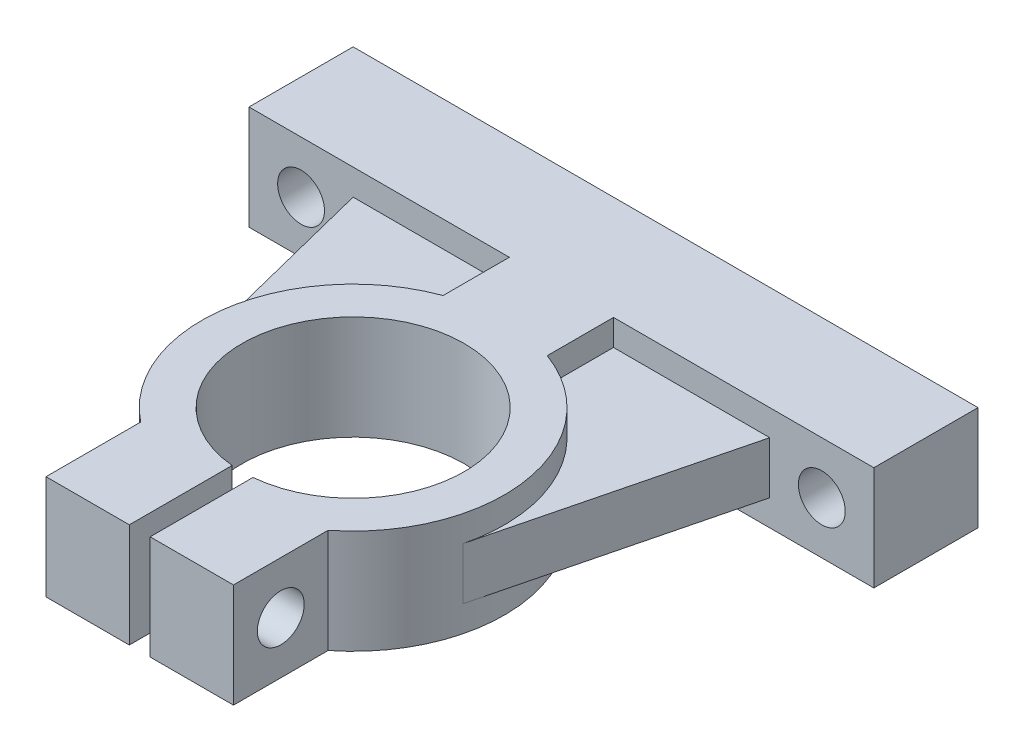
ISO-10303-21;
HEADER;
FILE_DESCRIPTION(('STEP AP214'),'2;1');
FILE_NAME('part.step','',(''),(''),'','','');
FILE_SCHEMA(('AUTOMOTIVE_DESIGN { 1 0 10303 214 1 1 1 1 }'));
ENDSEC;
DATA;
#1=APPLICATION_CONTEXT('core data for automotive mechanical design processes');
#2=APPLICATION_PROTOCOL_DEFINITION('international standard','automotive_design',2000,#1);
#3=PRODUCT_CONTEXT('',#1,'mechanical');
#4=PRODUCT('Part','Part','',(#3));
#5=PRODUCT_RELATED_PRODUCT_CATEGORY('part','',(#4));
#6=PRODUCT_DEFINITION_FORMATION('','',#4);
#7=PRODUCT_DEFINITION_CONTEXT('part definition',#1,'design');
#8=PRODUCT_DEFINITION('design','',#6,#7);
#9=PRODUCT_DEFINITION_SHAPE('','',#8);
#10=(LENGTH_UNIT() NAMED_UNIT(*) SI_UNIT(.MILLI.,.METRE.));
#11=(NAMED_UNIT(*) PLANE_ANGLE_UNIT() SI_UNIT($,.RADIAN.));
#12=(NAMED_UNIT(*) SI_UNIT($,.STERADIAN.) SOLID_ANGLE_UNIT());
#13=UNCERTAINTY_MEASURE_WITH_UNIT(LENGTH_MEASURE(1.E-05),#10,'distance_accuracy_value','');
#14=(GEOMETRIC_REPRESENTATION_CONTEXT(3) GLOBAL_UNCERTAINTY_ASSIGNED_CONTEXT((#13)) GLOBAL_UNIT_ASSIGNED_CONTEXT((#10,
#11,#12)) REPRESENTATION_CONTEXT('',''));
#15=CARTESIAN_POINT('',(0.,0.,0.));
#16=DIRECTION('',(0.,0.,1.));
#17=DIRECTION('',(1.,0.,0.));
#18=AXIS2_PLACEMENT_3D('',#15,#16,#17);
#19=CARTESIAN_POINT('',(0.,5.,30.));
#20=DIRECTION('',(0.,-1.,0.));
#21=DIRECTION('',(0.,0.,-1.));
#22=AXIS2_PLACEMENT_3D('',#19,#20,#21);
#23=CYLINDRICAL_SURFACE('',#22,14.525);
#24=CARTESIAN_POINT('',(0.,-5.,30.));
#25=DIRECTION('',(0.,1.,0.));
#26=DIRECTION('',(0.,0.,1.));
#27=AXIS2_PLACEMENT_3D('',#24,#25,#26);
#28=CIRCLE('',#27,14.525);
#29=CARTESIAN_POINT('',(-4.99999999999999,-5.,16.3627119631504));
#30=VERTEX_POINT('',#29);
#31=CARTESIAN_POINT('',(-9.,-5.,41.4006852864203));
#32=VERTEX_POINT('',#31);
#33=EDGE_CURVE('E63',#30,#32,#28,.T.);
#34=ORIENTED_EDGE('',*,*,#33,.T.);
#35=DIRECTION('',(0.,1.,0.));
#36=VECTOR('',#35,1.);
#37=CARTESIAN_POINT('',(-9.,-17.1088967549045,41.4006852864203));
#38=LINE('',#37,#36);
#39=CARTESIAN_POINT('',(-9.,5.,41.4006852864203));
#40=VERTEX_POINT('',#39);
#41=EDGE_CURVE('E58',#32,#40,#38,.T.);
#42=ORIENTED_EDGE('',*,*,#41,.T.);
#43=CARTESIAN_POINT('',(0.,5.,30.));
#44=DIRECTION('',(0.,1.,0.));
#45=DIRECTION('',(0.,0.,1.));
#46=AXIS2_PLACEMENT_3D('',#43,#44,#45);
#47=CIRCLE('',#46,14.525);
#48=CARTESIAN_POINT('',(-4.99999999999999,5.,16.3627119631504));
#49=VERTEX_POINT('',#48);
#50=EDGE_CURVE('E223',#49,#40,#47,.T.);
#51=ORIENTED_EDGE('',*,*,#50,.F.);
#52=DIRECTION('',(0.,-1.,0.));
#53=VECTOR('',#52,1.);
#54=CARTESIAN_POINT('',(-4.99999999999999,5.,16.3627119631504));
#55=LINE('',#54,#53);
#56=CARTESIAN_POINT('',(-4.99999999999999,2.5,16.3627119631504));
#57=VERTEX_POINT('',#56);
#58=EDGE_CURVE('E391',#49,#57,#55,.T.);
#59=ORIENTED_EDGE('',*,*,#58,.T.);
#60=CARTESIAN_POINT('',(0.,2.5,30.));
#61=DIRECTION('',(0.,1.,0.));
#62=DIRECTION('',(0.,0.,1.));
#63=AXIS2_PLACEMENT_3D('',#60,#61,#62);
#64=CIRCLE('',#63,14.525);
#65=CARTESIAN_POINT('',(-14.0873705997255,2.5,33.5385893497255));
#66=VERTEX_POINT('',#65);
#67=EDGE_CURVE('E262',#57,#66,#64,.T.);
#68=ORIENTED_EDGE('',*,*,#67,.T.);
#69=DIRECTION('',(0.,-1.,0.));
#70=VECTOR('',#69,1.);
#71=CARTESIAN_POINT('',(-14.0873705997255,2.5,33.5385893497255));
#72=LINE('',#71,#70);
#73=CARTESIAN_POINT('',(-14.0873705997255,-2.5,33.5385893497255));
#74=VERTEX_POINT('',#73);
#75=EDGE_CURVE('E272',#66,#74,#72,.T.);
#76=ORIENTED_EDGE('',*,*,#75,.T.);
#77=CARTESIAN_POINT('',(0.,-2.5,30.));
#78=DIRECTION('',(0.,1.,0.));
#79=DIRECTION('',(0.,0.,1.));
#80=AXIS2_PLACEMENT_3D('',#77,#78,#79);
#81=CIRCLE('',#80,14.525);
#82=CARTESIAN_POINT('',(-4.99999999999999,-2.5,16.3627119631504));
#83=VERTEX_POINT('',#82);
#84=EDGE_CURVE('E273',#83,#74,#81,.T.);
#85=ORIENTED_EDGE('',*,*,#84,.F.);
#86=EDGE_CURVE('E390',#83,#30,#55,.T.);
#87=ORIENTED_EDGE('',*,*,#86,.T.);
#88=EDGE_LOOP('',(#34,#42,#51,#59,#68,#76,#85,#87));
#89=FACE_BOUND('',#88,.T.);
#90=ADVANCED_FACE('F43',(#89),#23,.T.);
#91=CARTESIAN_POINT('',(-5.,5.,10.));
#92=DIRECTION('',(1.,0.,0.));
#93=DIRECTION('',(0.,0.,-1.));
#94=AXIS2_PLACEMENT_3D('',#91,#92,#93);
#95=PLANE('',#94);
#96=DIRECTION('',(0.,0.,1.));
#97=VECTOR('',#96,1.);
#98=CARTESIAN_POINT('',(-5.00000000000001,-2.5,0.));
#99=LINE('',#98,#97);
#100=CARTESIAN_POINT('',(-5.,-2.5,10.));
#101=VERTEX_POINT('',#100);
#102=EDGE_CURVE('E276',#101,#83,#99,.T.);
#103=ORIENTED_EDGE('',*,*,#102,.F.);
#104=DIRECTION('',(0.,-1.,0.));
#105=VECTOR('',#104,1.);
#106=CARTESIAN_POINT('',(-5.,5.,10.));
#107=LINE('',#106,#105);
#108=CARTESIAN_POINT('',(-5.,-5.,10.));
#109=VERTEX_POINT('',#108);
#110=EDGE_CURVE('E349',#101,#109,#107,.T.);
#111=ORIENTED_EDGE('',*,*,#110,.T.);
#112=DIRECTION('',(0.,0.,1.));
#113=VECTOR('',#112,1.);
#114=CARTESIAN_POINT('',(-5.,-5.,10.));
#115=LINE('',#114,#113);
#116=EDGE_CURVE('E329',#109,#30,#115,.T.);
#117=ORIENTED_EDGE('',*,*,#116,.T.);
#118=ORIENTED_EDGE('',*,*,#86,.F.);
#119=EDGE_LOOP('',(#103,#111,#117,#118));
#120=FACE_BOUND('',#119,.T.);
#121=ADVANCED_FACE('F462',(#120),#95,.F.);
#122=CARTESIAN_POINT('',(5.,5.,9.99999999999999));
#123=DIRECTION('',(-1.,0.,0.));
#124=DIRECTION('',(0.,0.,1.));
#125=AXIS2_PLACEMENT_3D('',#122,#123,#124);
#126=PLANE('',#125);
#127=DIRECTION('',(0.,0.,1.));
#128=VECTOR('',#127,1.);
#129=CARTESIAN_POINT('',(5.00000000000001,-2.5,0.));
#130=LINE('',#129,#128);
#131=CARTESIAN_POINT('',(5.,-2.5,9.99999999999999));
#132=VERTEX_POINT('',#131);
#133=CARTESIAN_POINT('',(5.,-2.5,16.3627119631504));
#134=VERTEX_POINT('',#133);
#135=EDGE_CURVE('E259',#132,#134,#130,.T.);
#136=ORIENTED_EDGE('',*,*,#135,.T.);
#137=DIRECTION('',(0.,-1.,0.));
#138=VECTOR('',#137,1.);
#139=CARTESIAN_POINT('',(5.,5.,16.3627119631504));
#140=LINE('',#139,#138);
#141=CARTESIAN_POINT('',(5.,-5.,16.3627119631504));
#142=VERTEX_POINT('',#141);
#143=EDGE_CURVE('E386',#134,#142,#140,.T.);
#144=ORIENTED_EDGE('',*,*,#143,.T.);
#145=DIRECTION('',(0.,0.,-1.));
#146=VECTOR('',#145,1.);
#147=CARTESIAN_POINT('',(5.,-5.,9.99999999999999));
#148=LINE('',#147,#146);
#149=CARTESIAN_POINT('',(5.,-5.,9.99999999999999));
#150=VERTEX_POINT('',#149);
#151=EDGE_CURVE('E354',#142,#150,#148,.T.);
#152=ORIENTED_EDGE('',*,*,#151,.T.);
#153=DIRECTION('',(0.,-1.,0.));
#154=VECTOR('',#153,1.);
#155=CARTESIAN_POINT('',(5.,5.,9.99999999999999));
#156=LINE('',#155,#154);
#157=EDGE_CURVE('E382',#132,#150,#156,.T.);
#158=ORIENTED_EDGE('',*,*,#157,.F.);
#159=EDGE_LOOP('',(#136,#144,#152,#158));
#160=FACE_BOUND('',#159,.T.);
#161=ADVANCED_FACE('F474',(#160),#126,.F.);
#162=CARTESIAN_POINT('',(0.,5.,30.));
#163=DIRECTION('',(0.,1.,0.));
#164=DIRECTION('',(0.,0.,1.));
#165=AXIS2_PLACEMENT_3D('',#162,#163,#164);
#166=PLANE('',#165);
#167=DIRECTION('',(0.,0.,1.));
#168=VECTOR('',#167,1.);
#169=CARTESIAN_POINT('',(-0.999999999999999,5.,46.5965));
#170=LINE('',#169,#168);
#171=CARTESIAN_POINT('',(-0.999999999999999,5.,40.6210274455911));
#172=VERTEX_POINT('',#171);
#173=CARTESIAN_POINT('',(-0.999999999999999,5.,50.490535704383));
#174=VERTEX_POINT('',#173);
#175=EDGE_CURVE('E236',#172,#174,#170,.T.);
#176=ORIENTED_EDGE('',*,*,#175,.F.);
#177=CARTESIAN_POINT('',(0.,5.,30.));
#178=DIRECTION('',(0.,1.,0.));
#179=DIRECTION('',(0.,0.,1.));
#180=AXIS2_PLACEMENT_3D('',#177,#178,#179);
#181=CIRCLE('',#180,10.668);
#182=CARTESIAN_POINT('',(1.,5.,40.6210274455911));
#183=VERTEX_POINT('',#182);
#184=EDGE_CURVE('E326',#183,#172,#181,.T.);
#185=ORIENTED_EDGE('',*,*,#184,.F.);
#186=DIRECTION('',(0.,0.,-1.));
#187=VECTOR('',#186,1.);
#188=CARTESIAN_POINT('',(1.,5.,46.5965));
#189=LINE('',#188,#187);
#190=CARTESIAN_POINT('',(0.999999999999999,5.,50.490535704383));
#191=VERTEX_POINT('',#190);
#192=EDGE_CURVE('E256',#191,#183,#189,.T.);
#193=ORIENTED_EDGE('',*,*,#192,.F.);
#194=DIRECTION('',(1.,0.,0.));
#195=VECTOR('',#194,1.);
#196=CARTESIAN_POINT('',(0.999999999999999,5.,50.490535704383));
#197=LINE('',#196,#195);
#198=CARTESIAN_POINT('',(9.,5.,50.4905357043831));
#199=VERTEX_POINT('',#198);
#200=EDGE_CURVE('E224',#191,#199,#197,.T.);
#201=ORIENTED_EDGE('',*,*,#200,.T.);
#202=DIRECTION('',(0.,0.,-1.));
#203=VECTOR('',#202,1.);
#204=CARTESIAN_POINT('',(9.,5.,50.4905357043831));
#205=LINE('',#204,#203);
#206=CARTESIAN_POINT('',(9.,5.,41.4006852864203));
#207=VERTEX_POINT('',#206);
#208=EDGE_CURVE('E227',#199,#207,#205,.T.);
#209=ORIENTED_EDGE('',*,*,#208,.T.);
#210=CARTESIAN_POINT('',(5.,5.,16.3627119631504));
#211=VERTEX_POINT('',#210);
#212=EDGE_CURVE('E334',#207,#211,#47,.T.);
#213=ORIENTED_EDGE('',*,*,#212,.T.);
#214=DIRECTION('',(0.,0.,-1.));
#215=VECTOR('',#214,1.);
#216=CARTESIAN_POINT('',(5.,5.,9.99999999999999));
#217=LINE('',#216,#215);
#218=CARTESIAN_POINT('',(5.,5.,9.99999999999999));
#219=VERTEX_POINT('',#218);
#220=EDGE_CURVE('E337',#211,#219,#217,.T.);
#221=ORIENTED_EDGE('',*,*,#220,.T.);
#222=DIRECTION('',(1.,0.,0.));
#223=VECTOR('',#222,1.);
#224=CARTESIAN_POINT('',(30.,5.,9.99999999999999));
#225=LINE('',#224,#223);
#226=CARTESIAN_POINT('',(30.,5.,9.99999999999999));
#227=VERTEX_POINT('',#226);
#228=EDGE_CURVE('E339',#219,#227,#225,.T.);
#229=ORIENTED_EDGE('',*,*,#228,.T.);
#230=DIRECTION('',(0.,0.,-1.));
#231=VECTOR('',#230,1.);
#232=CARTESIAN_POINT('',(30.,5.,0.));
#233=LINE('',#232,#231);
#234=CARTESIAN_POINT('',(30.,5.,0.));
#235=VERTEX_POINT('',#234);
#236=EDGE_CURVE('E341',#227,#235,#233,.T.);
#237=ORIENTED_EDGE('',*,*,#236,.T.);
#238=DIRECTION('',(-1.,0.,0.));
#239=VECTOR('',#238,1.);
#240=CARTESIAN_POINT('',(30.,5.,0.));
#241=LINE('',#240,#239);
#242=CARTESIAN_POINT('',(-30.,5.,0.));
#243=VERTEX_POINT('',#242);
#244=EDGE_CURVE('E343',#235,#243,#241,.T.);
#245=ORIENTED_EDGE('',*,*,#244,.T.);
#246=DIRECTION('',(0.,0.,1.));
#247=VECTOR('',#246,1.);
#248=CARTESIAN_POINT('',(-30.,5.,0.));
#249=LINE('',#248,#247);
#250=CARTESIAN_POINT('',(-30.,5.,10.));
#251=VERTEX_POINT('',#250);
#252=EDGE_CURVE('E345',#243,#251,#249,.T.);
#253=ORIENTED_EDGE('',*,*,#252,.T.);
#254=DIRECTION('',(1.,0.,0.));
#255=VECTOR('',#254,1.);
#256=CARTESIAN_POINT('',(-30.,5.,10.));
#257=LINE('',#256,#255);
#258=CARTESIAN_POINT('',(-5.,5.,10.));
#259=VERTEX_POINT('',#258);
#260=EDGE_CURVE('E347',#251,#259,#257,.T.);
#261=ORIENTED_EDGE('',*,*,#260,.T.);
#262=DIRECTION('',(0.,0.,1.));
#263=VECTOR('',#262,1.);
#264=CARTESIAN_POINT('',(-5.,5.,10.));
#265=LINE('',#264,#263);
#266=EDGE_CURVE('E332',#259,#49,#265,.T.);
#267=ORIENTED_EDGE('',*,*,#266,.T.);
#268=ORIENTED_EDGE('',*,*,#50,.T.);
#269=DIRECTION('',(0.,0.,1.));
#270=VECTOR('',#269,1.);
#271=CARTESIAN_POINT('',(-9.,5.,50.4905357043831));
#272=LINE('',#271,#270);
#273=CARTESIAN_POINT('',(-9.,5.,50.4905357043831));
#274=VERTEX_POINT('',#273);
#275=EDGE_CURVE('E207',#40,#274,#272,.T.);
#276=ORIENTED_EDGE('',*,*,#275,.T.);
#277=DIRECTION('',(1.,0.,0.));
#278=VECTOR('',#277,1.);
#279=CARTESIAN_POINT('',(-0.999999999999999,5.,50.490535704383));
#280=LINE('',#279,#278);
#281=EDGE_CURVE('E215',#274,#174,#280,.T.);
#282=ORIENTED_EDGE('',*,*,#281,.T.);
#283=EDGE_LOOP('',(#176,#185,#193,#201,#209,#213,#221,#229,#237,#245,#253,#261,#267,#268,#276,#282));
#284=FACE_BOUND('',#283,.T.);
#285=ADVANCED_FACE('F221',(#284),#166,.T.);
#286=CARTESIAN_POINT('',(0.,-5.,30.));
#287=DIRECTION('',(0.,1.,0.));
#288=DIRECTION('',(0.,0.,1.));
#289=AXIS2_PLACEMENT_3D('',#286,#287,#288);
#290=PLANE('',#289);
#291=CARTESIAN_POINT('',(0.,-5.,30.));
#292=DIRECTION('',(0.,1.,0.));
#293=DIRECTION('',(0.,0.,1.));
#294=AXIS2_PLACEMENT_3D('',#291,#292,#293);
#295=CIRCLE('',#294,10.668);
#296=CARTESIAN_POINT('',(1.,-5.,40.6210274455911));
#297=VERTEX_POINT('',#296);
#298=CARTESIAN_POINT('',(-1.,-5.,40.6210274455911));
#299=VERTEX_POINT('',#298);
#300=EDGE_CURVE('E321',#297,#299,#295,.T.);
#301=ORIENTED_EDGE('',*,*,#300,.T.);
#302=DIRECTION('',(0.,0.,1.));
#303=VECTOR('',#302,1.);
#304=CARTESIAN_POINT('',(-0.999999999999999,-5.,46.5965));
#305=LINE('',#304,#303);
#306=CARTESIAN_POINT('',(-0.999999999999999,-5.,50.490535704383));
#307=VERTEX_POINT('',#306);
#308=EDGE_CURVE('E253',#299,#307,#305,.T.);
#309=ORIENTED_EDGE('',*,*,#308,.T.);
#310=DIRECTION('',(-1.,0.,0.));
#311=VECTOR('',#310,1.);
#312=CARTESIAN_POINT('',(-0.999999999999999,-5.,50.490535704383));
#313=LINE('',#312,#311);
#314=CARTESIAN_POINT('',(-9.,-5.,50.4905357043831));
#315=VERTEX_POINT('',#314);
#316=EDGE_CURVE('E230',#307,#315,#313,.T.);
#317=ORIENTED_EDGE('',*,*,#316,.T.);
#318=DIRECTION('',(0.,0.,-1.));
#319=VECTOR('',#318,1.);
#320=CARTESIAN_POINT('',(-9.,-5.,50.4905357043831));
#321=LINE('',#320,#319);
#322=EDGE_CURVE('E208',#315,#32,#321,.T.);
#323=ORIENTED_EDGE('',*,*,#322,.T.);
#324=ORIENTED_EDGE('',*,*,#33,.F.);
#325=ORIENTED_EDGE('',*,*,#116,.F.);
#326=DIRECTION('',(1.,0.,0.));
#327=VECTOR('',#326,1.);
#328=CARTESIAN_POINT('',(-30.,-5.,10.));
#329=LINE('',#328,#327);
#330=CARTESIAN_POINT('',(-30.,-5.,10.));
#331=VERTEX_POINT('',#330);
#332=EDGE_CURVE('E335',#331,#109,#329,.T.);
#333=ORIENTED_EDGE('',*,*,#332,.F.);
#334=DIRECTION('',(0.,0.,1.));
#335=VECTOR('',#334,1.);
#336=CARTESIAN_POINT('',(-30.,-5.,0.));
#337=LINE('',#336,#335);
#338=CARTESIAN_POINT('',(-30.,-5.,0.));
#339=VERTEX_POINT('',#338);
#340=EDGE_CURVE('E363',#339,#331,#337,.T.);
#341=ORIENTED_EDGE('',*,*,#340,.F.);
#342=DIRECTION('',(-1.,0.,0.));
#343=VECTOR('',#342,1.);
#344=CARTESIAN_POINT('',(30.,-5.,0.));
#345=LINE('',#344,#343);
#346=CARTESIAN_POINT('',(30.,-5.,0.));
#347=VERTEX_POINT('',#346);
#348=EDGE_CURVE('E361',#347,#339,#345,.T.);
#349=ORIENTED_EDGE('',*,*,#348,.F.);
#350=DIRECTION('',(0.,0.,-1.));
#351=VECTOR('',#350,1.);
#352=CARTESIAN_POINT('',(30.,-5.,0.));
#353=LINE('',#352,#351);
#354=CARTESIAN_POINT('',(30.,-5.,9.99999999999999));
#355=VERTEX_POINT('',#354);
#356=EDGE_CURVE('E359',#355,#347,#353,.T.);
#357=ORIENTED_EDGE('',*,*,#356,.F.);
#358=DIRECTION('',(1.,0.,0.));
#359=VECTOR('',#358,1.);
#360=CARTESIAN_POINT('',(30.,-5.,9.99999999999999));
#361=LINE('',#360,#359);
#362=EDGE_CURVE('E357',#150,#355,#361,.T.);
#363=ORIENTED_EDGE('',*,*,#362,.F.);
#364=ORIENTED_EDGE('',*,*,#151,.F.);
#365=CARTESIAN_POINT('',(9.,-5.,41.4006852864203));
#366=VERTEX_POINT('',#365);
#367=EDGE_CURVE('E352',#366,#142,#28,.T.);
#368=ORIENTED_EDGE('',*,*,#367,.F.);
#369=DIRECTION('',(0.,0.,1.));
#370=VECTOR('',#369,1.);
#371=CARTESIAN_POINT('',(9.,-5.,50.4905357043831));
#372=LINE('',#371,#370);
#373=CARTESIAN_POINT('',(9.,-5.,50.4905357043831));
#374=VERTEX_POINT('',#373);
#375=EDGE_CURVE('E237',#366,#374,#372,.T.);
#376=ORIENTED_EDGE('',*,*,#375,.T.);
#377=DIRECTION('',(-1.,0.,0.));
#378=VECTOR('',#377,1.);
#379=CARTESIAN_POINT('',(0.999999999999999,-5.,50.490535704383));
#380=LINE('',#379,#378);
#381=CARTESIAN_POINT('',(0.999999999999999,-5.,50.490535704383));
#382=VERTEX_POINT('',#381);
#383=EDGE_CURVE('E239',#374,#382,#380,.T.);
#384=ORIENTED_EDGE('',*,*,#383,.T.);
#385=DIRECTION('',(0.,0.,-1.));
#386=VECTOR('',#385,1.);
#387=CARTESIAN_POINT('',(1.,-5.,46.5965));
#388=LINE('',#387,#386);
#389=EDGE_CURVE('E255',#382,#297,#388,.T.);
#390=ORIENTED_EDGE('',*,*,#389,.T.);
#391=EDGE_LOOP('',(#301,#309,#317,#323,#324,#325,#333,#341,#349,#357,#363,#364,#368,#376,#384,#390));
#392=FACE_BOUND('',#391,.T.);
#393=ADVANCED_FACE('F400',(#392),#290,.F.);
#394=CARTESIAN_POINT('',(-5.,2.5,10.));
#395=VERTEX_POINT('',#394);
#396=EDGE_CURVE('E367',#259,#395,#107,.T.);
#397=ORIENTED_EDGE('',*,*,#396,.T.);
#398=DIRECTION('',(0.,0.,1.));
#399=VECTOR('',#398,1.);
#400=CARTESIAN_POINT('',(-5.00000000000001,2.5,0.));
#401=LINE('',#400,#399);
#402=EDGE_CURVE('E264',#395,#57,#401,.T.);
#403=ORIENTED_EDGE('',*,*,#402,.T.);
#404=ORIENTED_EDGE('',*,*,#58,.F.);
#405=ORIENTED_EDGE('',*,*,#266,.F.);
#406=EDGE_LOOP('',(#397,#403,#404,#405));
#407=FACE_BOUND('',#406,.T.);
#408=ADVANCED_FACE('F45',(#407),#95,.F.);
#409=ORIENTED_EDGE('',*,*,#212,.F.);
#410=DIRECTION('',(0.,1.,0.));
#411=VECTOR('',#410,1.);
#412=CARTESIAN_POINT('',(9.,-17.1088967549045,41.4006852864203));
#413=LINE('',#412,#411);
#414=EDGE_CURVE('E243',#366,#207,#413,.T.);
#415=ORIENTED_EDGE('',*,*,#414,.F.);
#416=ORIENTED_EDGE('',*,*,#367,.T.);
#417=ORIENTED_EDGE('',*,*,#143,.F.);
#418=CARTESIAN_POINT('',(0.,-2.5,30.));
#419=DIRECTION('',(0.,1.,0.));
#420=DIRECTION('',(0.,0.,1.));
#421=AXIS2_PLACEMENT_3D('',#418,#419,#420);
#422=CIRCLE('',#421,14.525);
#423=CARTESIAN_POINT('',(14.0873705997255,-2.5,33.5385893497255));
#424=VERTEX_POINT('',#423);
#425=EDGE_CURVE('E305',#134,#424,#422,.F.);
#426=ORIENTED_EDGE('',*,*,#425,.T.);
#427=DIRECTION('',(0.,-1.,0.));
#428=VECTOR('',#427,1.);
#429=CARTESIAN_POINT('',(14.0873705997255,2.5,33.5385893497255));
#430=LINE('',#429,#428);
#431=CARTESIAN_POINT('',(14.0873705997255,2.5,33.5385893497255));
#432=VERTEX_POINT('',#431);
#433=EDGE_CURVE('E277',#432,#424,#430,.T.);
#434=ORIENTED_EDGE('',*,*,#433,.F.);
#435=CARTESIAN_POINT('',(0.,2.5,30.));
#436=DIRECTION('',(0.,1.,0.));
#437=DIRECTION('',(0.,0.,1.));
#438=AXIS2_PLACEMENT_3D('',#435,#436,#437);
#439=CIRCLE('',#438,14.525);
#440=CARTESIAN_POINT('',(5.,2.5,16.3627119631504));
#441=VERTEX_POINT('',#440);
#442=EDGE_CURVE('E293',#441,#432,#439,.F.);
#443=ORIENTED_EDGE('',*,*,#442,.F.);
#444=EDGE_CURVE('E387',#211,#441,#140,.T.);
#445=ORIENTED_EDGE('',*,*,#444,.F.);
#446=EDGE_LOOP('',(#409,#415,#416,#417,#426,#434,#443,#445));
#447=FACE_BOUND('',#446,.T.);
#448=ADVANCED_FACE('F419',(#447),#23,.T.);
#449=ORIENTED_EDGE('',*,*,#444,.T.);
#450=DIRECTION('',(0.,0.,1.));
#451=VECTOR('',#450,1.);
#452=CARTESIAN_POINT('',(5.00000000000001,2.5,0.));
#453=LINE('',#452,#451);
#454=CARTESIAN_POINT('',(5.,2.5,9.99999999999999));
#455=VERTEX_POINT('',#454);
#456=EDGE_CURVE('E290',#455,#441,#453,.T.);
#457=ORIENTED_EDGE('',*,*,#456,.F.);
#458=EDGE_CURVE('E383',#219,#455,#156,.T.);
#459=ORIENTED_EDGE('',*,*,#458,.F.);
#460=ORIENTED_EDGE('',*,*,#220,.F.);
#461=EDGE_LOOP('',(#449,#457,#459,#460));
#462=FACE_BOUND('',#461,.T.);
#463=ADVANCED_FACE('F421',(#462),#126,.F.);
#464=CARTESIAN_POINT('',(30.,5.,9.99999999999999));
#465=DIRECTION('',(0.,0.,-1.));
#466=DIRECTION('',(-1.,0.,0.));
#467=AXIS2_PLACEMENT_3D('',#464,#465,#466);
#468=PLANE('',#467);
#469=CARTESIAN_POINT('',(25.,0.,9.99999999999999));
#470=DIRECTION('',(0.,0.,-1.));
#471=DIRECTION('',(-1.,0.,0.));
#472=AXIS2_PLACEMENT_3D('',#469,#470,#471);
#473=CIRCLE('',#472,2.25);
#474=CARTESIAN_POINT('',(22.75,0.,9.99999999999999));
#475=VERTEX_POINT('',#474);
#476=EDGE_CURVE('E289',#475,#475,#473,.F.);
#477=ORIENTED_EDGE('',*,*,#476,.F.);
#478=EDGE_LOOP('',(#477));
#479=FACE_BOUND('',#478,.T.);
#480=ORIENTED_EDGE('',*,*,#458,.T.);
#481=DIRECTION('',(-1.,0.,0.));
#482=VECTOR('',#481,1.);
#483=CARTESIAN_POINT('',(0.,2.5,9.99999999999999));
#484=LINE('',#483,#482);
#485=CARTESIAN_POINT('',(20.,2.5,9.99999999999999));
#486=VERTEX_POINT('',#485);
#487=EDGE_CURVE('E300',#486,#455,#484,.T.);
#488=ORIENTED_EDGE('',*,*,#487,.F.);
#489=DIRECTION('',(0.,-1.,0.));
#490=VECTOR('',#489,1.);
#491=CARTESIAN_POINT('',(20.,2.5,10.));
#492=LINE('',#491,#490);
#493=CARTESIAN_POINT('',(20.,-2.5,10.));
#494=VERTEX_POINT('',#493);
#495=EDGE_CURVE('E303',#486,#494,#492,.T.);
#496=ORIENTED_EDGE('',*,*,#495,.T.);
#497=DIRECTION('',(-1.,0.,0.));
#498=VECTOR('',#497,1.);
#499=CARTESIAN_POINT('',(0.,-2.5,9.99999999999999));
#500=LINE('',#499,#498);
#501=EDGE_CURVE('E294',#494,#132,#500,.T.);
#502=ORIENTED_EDGE('',*,*,#501,.T.);
#503=ORIENTED_EDGE('',*,*,#157,.T.);
#504=ORIENTED_EDGE('',*,*,#362,.T.);
#505=DIRECTION('',(0.,-1.,0.));
#506=VECTOR('',#505,1.);
#507=CARTESIAN_POINT('',(30.,5.,9.99999999999999));
#508=LINE('',#507,#506);
#509=EDGE_CURVE('E379',#227,#355,#508,.T.);
#510=ORIENTED_EDGE('',*,*,#509,.F.);
#511=ORIENTED_EDGE('',*,*,#228,.F.);
#512=EDGE_LOOP('',(#480,#488,#496,#502,#503,#504,#510,#511));
#513=FACE_BOUND('',#512,.T.);
#514=ADVANCED_FACE('F425',(#479,#513),#468,.F.);
#515=CARTESIAN_POINT('',(30.,5.,0.));
#516=DIRECTION('',(-1.,0.,0.));
#517=DIRECTION('',(0.,0.,1.));
#518=AXIS2_PLACEMENT_3D('',#515,#516,#517);
#519=PLANE('',#518);
#520=ORIENTED_EDGE('',*,*,#356,.T.);
#521=DIRECTION('',(0.,-1.,0.));
#522=VECTOR('',#521,1.);
#523=CARTESIAN_POINT('',(30.,5.,0.));
#524=LINE('',#523,#522);
#525=EDGE_CURVE('E376',#235,#347,#524,.T.);
#526=ORIENTED_EDGE('',*,*,#525,.F.);
#527=ORIENTED_EDGE('',*,*,#236,.F.);
#528=ORIENTED_EDGE('',*,*,#509,.T.);
#529=EDGE_LOOP('',(#520,#526,#527,#528));
#530=FACE_BOUND('',#529,.T.);
#531=ADVANCED_FACE('F431',(#530),#519,.F.);
#532=CARTESIAN_POINT('',(30.,5.,0.));
#533=DIRECTION('',(0.,0.,1.));
#534=DIRECTION('',(1.,0.,0.));
#535=AXIS2_PLACEMENT_3D('',#532,#533,#534);
#536=PLANE('',#535);
#537=CARTESIAN_POINT('',(-25.,0.,0.));
#538=DIRECTION('',(0.,0.,-1.));
#539=DIRECTION('',(-1.,0.,0.));
#540=AXIS2_PLACEMENT_3D('',#537,#538,#539);
#541=CIRCLE('',#540,2.25);
#542=CARTESIAN_POINT('',(-27.25,0.,0.));
#543=VERTEX_POINT('',#542);
#544=EDGE_CURVE('E314',#543,#543,#541,.T.);
#545=ORIENTED_EDGE('',*,*,#544,.F.);
#546=EDGE_LOOP('',(#545));
#547=FACE_BOUND('',#546,.T.);
#548=CARTESIAN_POINT('',(25.,0.,0.));
#549=DIRECTION('',(0.,0.,-1.));
#550=DIRECTION('',(-1.,0.,0.));
#551=AXIS2_PLACEMENT_3D('',#548,#549,#550);
#552=CIRCLE('',#551,2.25);
#553=CARTESIAN_POINT('',(22.75,0.,0.));
#554=VERTEX_POINT('',#553);
#555=EDGE_CURVE('E318',#554,#554,#552,.T.);
#556=ORIENTED_EDGE('',*,*,#555,.F.);
#557=EDGE_LOOP('',(#556));
#558=FACE_BOUND('',#557,.T.);
#559=ORIENTED_EDGE('',*,*,#348,.T.);
#560=DIRECTION('',(0.,-1.,0.));
#561=VECTOR('',#560,1.);
#562=CARTESIAN_POINT('',(-30.,5.,0.));
#563=LINE('',#562,#561);
#564=EDGE_CURVE('E373',#243,#339,#563,.T.);
#565=ORIENTED_EDGE('',*,*,#564,.F.);
#566=ORIENTED_EDGE('',*,*,#244,.F.);
#567=ORIENTED_EDGE('',*,*,#525,.T.);
#568=EDGE_LOOP('',(#559,#565,#566,#567));
#569=FACE_BOUND('',#568,.T.);
#570=ADVANCED_FACE('F435',(#547,#558,#569),#536,.F.);
#571=CARTESIAN_POINT('',(-30.,5.,0.));
#572=DIRECTION('',(1.,0.,0.));
#573=DIRECTION('',(0.,0.,-1.));
#574=AXIS2_PLACEMENT_3D('',#571,#572,#573);
#575=PLANE('',#574);
#576=ORIENTED_EDGE('',*,*,#340,.T.);
#577=DIRECTION('',(0.,-1.,0.));
#578=VECTOR('',#577,1.);
#579=CARTESIAN_POINT('',(-30.,5.,10.));
#580=LINE('',#579,#578);
#581=EDGE_CURVE('E370',#251,#331,#580,.T.);
#582=ORIENTED_EDGE('',*,*,#581,.F.);
#583=ORIENTED_EDGE('',*,*,#252,.F.);
#584=ORIENTED_EDGE('',*,*,#564,.T.);
#585=EDGE_LOOP('',(#576,#582,#583,#584));
#586=FACE_BOUND('',#585,.T.);
#587=ADVANCED_FACE('F440',(#586),#575,.F.);
#588=CARTESIAN_POINT('',(-30.,5.,10.));
#589=DIRECTION('',(0.,0.,-1.));
#590=DIRECTION('',(-1.,0.,0.));
#591=AXIS2_PLACEMENT_3D('',#588,#589,#590);
#592=PLANE('',#591);
#593=CARTESIAN_POINT('',(-25.,0.,10.));
#594=DIRECTION('',(0.,0.,-1.));
#595=DIRECTION('',(-1.,0.,0.));
#596=AXIS2_PLACEMENT_3D('',#593,#594,#595);
#597=CIRCLE('',#596,2.25);
#598=CARTESIAN_POINT('',(-27.25,0.,10.));
#599=VERTEX_POINT('',#598);
#600=EDGE_CURVE('E317',#599,#599,#597,.F.);
#601=ORIENTED_EDGE('',*,*,#600,.F.);
#602=EDGE_LOOP('',(#601));
#603=FACE_BOUND('',#602,.T.);
#604=DIRECTION('',(0.,-1.,0.));
#605=VECTOR('',#604,1.);
#606=CARTESIAN_POINT('',(-20.,2.5,10.));
#607=LINE('',#606,#605);
#608=CARTESIAN_POINT('',(-20.,2.5,10.));
#609=VERTEX_POINT('',#608);
#610=CARTESIAN_POINT('',(-20.,-2.5,10.));
#611=VERTEX_POINT('',#610);
#612=EDGE_CURVE('E286',#609,#611,#607,.T.);
#613=ORIENTED_EDGE('',*,*,#612,.F.);
#614=DIRECTION('',(1.,0.,0.));
#615=VECTOR('',#614,1.);
#616=CARTESIAN_POINT('',(0.,2.5,9.99999999999999));
#617=LINE('',#616,#615);
#618=EDGE_CURVE('E267',#609,#395,#617,.T.);
#619=ORIENTED_EDGE('',*,*,#618,.T.);
#620=ORIENTED_EDGE('',*,*,#396,.F.);
#621=ORIENTED_EDGE('',*,*,#260,.F.);
#622=ORIENTED_EDGE('',*,*,#581,.T.);
#623=ORIENTED_EDGE('',*,*,#332,.T.);
#624=ORIENTED_EDGE('',*,*,#110,.F.);
#625=DIRECTION('',(1.,0.,0.));
#626=VECTOR('',#625,1.);
#627=CARTESIAN_POINT('',(0.,-2.5,9.99999999999999));
#628=LINE('',#627,#626);
#629=EDGE_CURVE('E280',#611,#101,#628,.T.);
#630=ORIENTED_EDGE('',*,*,#629,.F.);
#631=EDGE_LOOP('',(#613,#619,#620,#621,#622,#623,#624,#630));
#632=FACE_BOUND('',#631,.T.);
#633=ADVANCED_FACE('F446',(#603,#632),#592,.F.);
#634=CARTESIAN_POINT('',(0.,5.,30.));
#635=DIRECTION('',(0.,-1.,0.));
#636=DIRECTION('',(0.,0.,-1.));
#637=AXIS2_PLACEMENT_3D('',#634,#635,#636);
#638=CYLINDRICAL_SURFACE('',#637,10.668);
#639=DIRECTION('',(0.,-1.,0.));
#640=VECTOR('',#639,1.);
#641=CARTESIAN_POINT('',(-0.999999999999999,5.,40.6210274455911));
#642=LINE('',#641,#640);
#643=EDGE_CURVE('E11',#299,#172,#642,.F.);
#644=ORIENTED_EDGE('',*,*,#643,.F.);
#645=ORIENTED_EDGE('',*,*,#300,.F.);
#646=DIRECTION('',(0.,-1.,0.));
#647=VECTOR('',#646,1.);
#648=CARTESIAN_POINT('',(1.,5.,40.6210274455911));
#649=LINE('',#648,#647);
#650=EDGE_CURVE('E51',#183,#297,#649,.T.);
#651=ORIENTED_EDGE('',*,*,#650,.F.);
#652=ORIENTED_EDGE('',*,*,#184,.T.);
#653=EDGE_LOOP('',(#644,#645,#651,#652));
#654=FACE_BOUND('',#653,.T.);
#655=ADVANCED_FACE('F404',(#654),#638,.F.);
#656=CARTESIAN_POINT('',(-25.,0.,44.526));
#657=DIRECTION('',(0.,0.,-1.));
#658=DIRECTION('',(-1.,0.,0.));
#659=AXIS2_PLACEMENT_3D('',#656,#657,#658);
#660=CYLINDRICAL_SURFACE('',#659,2.25);
#661=ORIENTED_EDGE('',*,*,#544,.T.);
#662=EDGE_LOOP('',(#661));
#663=FACE_BOUND('',#662,.T.);
#664=ORIENTED_EDGE('',*,*,#600,.T.);
#665=EDGE_LOOP('',(#664));
#666=FACE_BOUND('',#665,.T.);
#667=ADVANCED_FACE('F536',(#663,#666),#660,.F.);
#668=CARTESIAN_POINT('',(25.,0.,44.526));
#669=DIRECTION('',(0.,0.,-1.));
#670=DIRECTION('',(-1.,0.,0.));
#671=AXIS2_PLACEMENT_3D('',#668,#669,#670);
#672=CYLINDRICAL_SURFACE('',#671,2.25);
#673=ORIENTED_EDGE('',*,*,#555,.T.);
#674=EDGE_LOOP('',(#673));
#675=FACE_BOUND('',#674,.T.);
#676=ORIENTED_EDGE('',*,*,#476,.T.);
#677=EDGE_LOOP('',(#676));
#678=FACE_BOUND('',#677,.T.);
#679=ADVANCED_FACE('F534',(#675,#678),#672,.F.);
#680=CARTESIAN_POINT('',(-21.1757846622255,2.5,5.31911938763727));
#681=DIRECTION('',(0.969870609275419,0.,-0.24362060927542));
#682=DIRECTION('',(-0.24362060927542,0.,-0.969870609275419));
#683=AXIS2_PLACEMENT_3D('',#680,#681,#682);
#684=PLANE('',#683);
#685=DIRECTION('',(0.24362060927542,0.,0.969870609275419));
#686=VECTOR('',#685,1.);
#687=CARTESIAN_POINT('',(-21.1757846622255,-2.5,5.31911938763727));
#688=LINE('',#687,#686);
#689=EDGE_CURVE('E265',#611,#74,#688,.T.);
#690=ORIENTED_EDGE('',*,*,#689,.T.);
#691=ORIENTED_EDGE('',*,*,#75,.F.);
#692=DIRECTION('',(0.24362060927542,0.,0.969870609275419));
#693=VECTOR('',#692,1.);
#694=CARTESIAN_POINT('',(-21.1757846622255,2.5,5.31911938763727));
#695=LINE('',#694,#693);
#696=EDGE_CURVE('E269',#609,#66,#695,.T.);
#697=ORIENTED_EDGE('',*,*,#696,.F.);
#698=ORIENTED_EDGE('',*,*,#612,.T.);
#699=EDGE_LOOP('',(#690,#691,#697,#698));
#700=FACE_BOUND('',#699,.T.);
#701=ADVANCED_FACE('F456',(#700),#684,.F.);
#702=CARTESIAN_POINT('',(0.,2.5,0.));
#703=DIRECTION('',(0.,1.,0.));
#704=DIRECTION('',(0.,0.,1.));
#705=AXIS2_PLACEMENT_3D('',#702,#703,#704);
#706=PLANE('',#705);
#707=ORIENTED_EDGE('',*,*,#67,.F.);
#708=ORIENTED_EDGE('',*,*,#402,.F.);
#709=ORIENTED_EDGE('',*,*,#618,.F.);
#710=ORIENTED_EDGE('',*,*,#696,.T.);
#711=EDGE_LOOP('',(#707,#708,#709,#710));
#712=FACE_BOUND('',#711,.T.);
#713=ADVANCED_FACE('F452',(#712),#706,.T.);
#714=CARTESIAN_POINT('',(0.,-2.5,0.));
#715=DIRECTION('',(0.,1.,0.));
#716=DIRECTION('',(0.,0.,1.));
#717=AXIS2_PLACEMENT_3D('',#714,#715,#716);
#718=PLANE('',#717);
#719=ORIENTED_EDGE('',*,*,#84,.T.);
#720=ORIENTED_EDGE('',*,*,#689,.F.);
#721=ORIENTED_EDGE('',*,*,#629,.T.);
#722=ORIENTED_EDGE('',*,*,#102,.T.);
#723=EDGE_LOOP('',(#719,#720,#721,#722));
#724=FACE_BOUND('',#723,.T.);
#725=ADVANCED_FACE('F464',(#724),#718,.F.);
#726=CARTESIAN_POINT('',(21.1757846622255,2.5,5.31911938763727));
#727=DIRECTION('',(0.969870609275419,0.,0.24362060927542));
#728=DIRECTION('',(0.24362060927542,0.,-0.969870609275419));
#729=AXIS2_PLACEMENT_3D('',#726,#727,#728);
#730=PLANE('',#729);
#731=DIRECTION('',(-0.24362060927542,0.,0.969870609275419));
#732=VECTOR('',#731,1.);
#733=CARTESIAN_POINT('',(21.1757846622255,-2.5,5.31911938763727));
#734=LINE('',#733,#732);
#735=EDGE_CURVE('E307',#494,#424,#734,.T.);
#736=ORIENTED_EDGE('',*,*,#735,.F.);
#737=ORIENTED_EDGE('',*,*,#495,.F.);
#738=DIRECTION('',(-0.24362060927542,0.,0.969870609275419));
#739=VECTOR('',#738,1.);
#740=CARTESIAN_POINT('',(21.1757846622255,2.5,5.31911938763727));
#741=LINE('',#740,#739);
#742=EDGE_CURVE('E297',#486,#432,#741,.T.);
#743=ORIENTED_EDGE('',*,*,#742,.T.);
#744=ORIENTED_EDGE('',*,*,#433,.T.);
#745=EDGE_LOOP('',(#736,#737,#743,#744));
#746=FACE_BOUND('',#745,.T.);
#747=ADVANCED_FACE('F482',(#746),#730,.T.);
#748=CARTESIAN_POINT('',(0.,2.5,0.));
#749=DIRECTION('',(0.,1.,0.));
#750=DIRECTION('',(0.,0.,1.));
#751=AXIS2_PLACEMENT_3D('',#748,#749,#750);
#752=PLANE('',#751);
#753=ORIENTED_EDGE('',*,*,#456,.T.);
#754=ORIENTED_EDGE('',*,*,#442,.T.);
#755=ORIENTED_EDGE('',*,*,#742,.F.);
#756=ORIENTED_EDGE('',*,*,#487,.T.);
#757=EDGE_LOOP('',(#753,#754,#755,#756));
#758=FACE_BOUND('',#757,.T.);
#759=ADVANCED_FACE('F485',(#758),#752,.T.);
#760=CARTESIAN_POINT('',(0.,-2.5,0.));
#761=DIRECTION('',(0.,1.,0.));
#762=DIRECTION('',(0.,0.,1.));
#763=AXIS2_PLACEMENT_3D('',#760,#761,#762);
#764=PLANE('',#763);
#765=ORIENTED_EDGE('',*,*,#135,.F.);
#766=ORIENTED_EDGE('',*,*,#501,.F.);
#767=ORIENTED_EDGE('',*,*,#735,.T.);
#768=ORIENTED_EDGE('',*,*,#425,.F.);
#769=EDGE_LOOP('',(#765,#766,#767,#768));
#770=FACE_BOUND('',#769,.T.);
#771=ADVANCED_FACE('F478',(#770),#764,.F.);
#772=CARTESIAN_POINT('',(1.,-5.,46.5965));
#773=DIRECTION('',(1.,0.,0.));
#774=DIRECTION('',(0.,0.,-1.));
#775=AXIS2_PLACEMENT_3D('',#772,#773,#774);
#776=PLANE('',#775);
#777=CARTESIAN_POINT('',(0.999999999999999,0.,45.9456104954017));
#778=DIRECTION('',(1.,0.,0.));
#779=DIRECTION('',(0.,0.,-1.));
#780=AXIS2_PLACEMENT_3D('',#777,#778,#779);
#781=CIRCLE('',#780,2.25);
#782=CARTESIAN_POINT('',(0.999999999999999,0.,43.6956104954017));
#783=VERTEX_POINT('',#782);
#784=EDGE_CURVE('E240',#783,#783,#781,.T.);
#785=ORIENTED_EDGE('',*,*,#784,.T.);
#786=EDGE_LOOP('',(#785));
#787=FACE_BOUND('',#786,.T.);
#788=ORIENTED_EDGE('',*,*,#192,.T.);
#789=ORIENTED_EDGE('',*,*,#650,.T.);
#790=ORIENTED_EDGE('',*,*,#389,.F.);
#791=DIRECTION('',(0.,1.,0.));
#792=VECTOR('',#791,1.);
#793=CARTESIAN_POINT('',(0.999999999999999,-17.1088967549045,50.490535704383));
#794=LINE('',#793,#792);
#795=EDGE_CURVE('E246',#382,#191,#794,.T.);
#796=ORIENTED_EDGE('',*,*,#795,.T.);
#797=EDGE_LOOP('',(#788,#789,#790,#796));
#798=FACE_BOUND('',#797,.T.);
#799=ADVANCED_FACE('F395',(#787,#798),#776,.F.);
#800=CARTESIAN_POINT('',(-0.999999999999999,-5.,46.5965));
#801=DIRECTION('',(-1.,0.,0.));
#802=DIRECTION('',(0.,0.,1.));
#803=AXIS2_PLACEMENT_3D('',#800,#801,#802);
#804=PLANE('',#803);
#805=CARTESIAN_POINT('',(-0.999999999999999,0.,45.9456104954017));
#806=DIRECTION('',(-1.,0.,0.));
#807=DIRECTION('',(0.,0.,1.));
#808=AXIS2_PLACEMENT_3D('',#805,#806,#807);
#809=CIRCLE('',#808,2.25);
#810=CARTESIAN_POINT('',(-0.999999999999999,0.,48.1956104954017));
#811=VERTEX_POINT('',#810);
#812=EDGE_CURVE('E726',#811,#811,#809,.T.);
#813=ORIENTED_EDGE('',*,*,#812,.T.);
#814=EDGE_LOOP('',(#813));
#815=FACE_BOUND('',#814,.T.);
#816=ORIENTED_EDGE('',*,*,#308,.F.);
#817=ORIENTED_EDGE('',*,*,#643,.T.);
#818=ORIENTED_EDGE('',*,*,#175,.T.);
#819=DIRECTION('',(0.,1.,0.));
#820=VECTOR('',#819,1.);
#821=CARTESIAN_POINT('',(-0.999999999999999,-17.1088967549045,50.490535704383));
#822=LINE('',#821,#820);
#823=EDGE_CURVE('E211',#307,#174,#822,.T.);
#824=ORIENTED_EDGE('',*,*,#823,.F.);
#825=EDGE_LOOP('',(#816,#817,#818,#824));
#826=FACE_BOUND('',#825,.T.);
#827=ADVANCED_FACE('F406',(#815,#826),#804,.F.);
#828=CARTESIAN_POINT('',(-0.999999999999999,-17.1088967549045,50.490535704383));
#829=DIRECTION('',(0.,0.,1.));
#830=DIRECTION('',(1.,0.,0.));
#831=AXIS2_PLACEMENT_3D('',#828,#829,#830);
#832=PLANE('',#831);
#833=ORIENTED_EDGE('',*,*,#316,.F.);
#834=ORIENTED_EDGE('',*,*,#823,.T.);
#835=ORIENTED_EDGE('',*,*,#281,.F.);
#836=DIRECTION('',(0.,1.,0.));
#837=VECTOR('',#836,1.);
#838=CARTESIAN_POINT('',(-9.,-17.1088967549045,50.4905357043831));
#839=LINE('',#838,#837);
#840=EDGE_CURVE('E203',#315,#274,#839,.T.);
#841=ORIENTED_EDGE('',*,*,#840,.F.);
#842=EDGE_LOOP('',(#833,#834,#835,#841));
#843=FACE_BOUND('',#842,.T.);
#844=ADVANCED_FACE('F216',(#843),#832,.T.);
#845=CARTESIAN_POINT('',(-9.,-17.1088967549045,50.4905357043831));
#846=DIRECTION('',(-1.,0.,0.));
#847=DIRECTION('',(0.,0.,1.));
#848=AXIS2_PLACEMENT_3D('',#845,#846,#847);
#849=PLANE('',#848);
#850=CARTESIAN_POINT('',(-9.,0.,45.9456104954017));
#851=DIRECTION('',(-1.,0.,0.));
#852=DIRECTION('',(0.,0.,1.));
#853=AXIS2_PLACEMENT_3D('',#850,#851,#852);
#854=CIRCLE('',#853,2.25);
#855=CARTESIAN_POINT('',(-9.,0.,48.1956104954017));
#856=VERTEX_POINT('',#855);
#857=EDGE_CURVE('E728',#856,#856,#854,.F.);
#858=ORIENTED_EDGE('',*,*,#857,.T.);
#859=EDGE_LOOP('',(#858));
#860=FACE_BOUND('',#859,.T.);
#861=ORIENTED_EDGE('',*,*,#322,.F.);
#862=ORIENTED_EDGE('',*,*,#840,.T.);
#863=ORIENTED_EDGE('',*,*,#275,.F.);
#864=ORIENTED_EDGE('',*,*,#41,.F.);
#865=EDGE_LOOP('',(#861,#862,#863,#864));
#866=FACE_BOUND('',#865,.T.);
#867=ADVANCED_FACE('F205',(#860,#866),#849,.T.);
#868=CARTESIAN_POINT('',(0.999999999999999,-17.1088967549045,50.490535704383));
#869=DIRECTION('',(0.,0.,1.));
#870=DIRECTION('',(1.,0.,0.));
#871=AXIS2_PLACEMENT_3D('',#868,#869,#870);
#872=PLANE('',#871);
#873=ORIENTED_EDGE('',*,*,#383,.F.);
#874=DIRECTION('',(0.,1.,0.));
#875=VECTOR('',#874,1.);
#876=CARTESIAN_POINT('',(9.,-17.1088967549045,50.4905357043831));
#877=LINE('',#876,#875);
#878=EDGE_CURVE('E241',#374,#199,#877,.T.);
#879=ORIENTED_EDGE('',*,*,#878,.T.);
#880=ORIENTED_EDGE('',*,*,#200,.F.);
#881=ORIENTED_EDGE('',*,*,#795,.F.);
#882=EDGE_LOOP('',(#873,#879,#880,#881));
#883=FACE_BOUND('',#882,.T.);
#884=ADVANCED_FACE('F409',(#883),#872,.T.);
#885=CARTESIAN_POINT('',(9.,-17.1088967549045,50.4905357043831));
#886=DIRECTION('',(1.,0.,0.));
#887=DIRECTION('',(0.,0.,-1.));
#888=AXIS2_PLACEMENT_3D('',#885,#886,#887);
#889=PLANE('',#888);
#890=CARTESIAN_POINT('',(8.99999999999999,0.,45.9456104954017));
#891=DIRECTION('',(1.,0.,0.));
#892=DIRECTION('',(0.,0.,-1.));
#893=AXIS2_PLACEMENT_3D('',#890,#891,#892);
#894=CIRCLE('',#893,2.25);
#895=CARTESIAN_POINT('',(8.99999999999999,0.,43.6956104954017));
#896=VERTEX_POINT('',#895);
#897=EDGE_CURVE('E723',#896,#896,#894,.T.);
#898=ORIENTED_EDGE('',*,*,#897,.F.);
#899=EDGE_LOOP('',(#898));
#900=FACE_BOUND('',#899,.T.);
#901=ORIENTED_EDGE('',*,*,#375,.F.);
#902=ORIENTED_EDGE('',*,*,#414,.T.);
#903=ORIENTED_EDGE('',*,*,#208,.F.);
#904=ORIENTED_EDGE('',*,*,#878,.F.);
#905=EDGE_LOOP('',(#901,#902,#903,#904));
#906=FACE_BOUND('',#905,.T.);
#907=ADVANCED_FACE('F414',(#900,#906),#889,.T.);
#908=CARTESIAN_POINT('',(-15.3639610306789,0.,45.9456104954017));
#909=DIRECTION('',(1.,0.,0.));
#910=DIRECTION('',(0.,0.,-1.));
#911=AXIS2_PLACEMENT_3D('',#908,#909,#910);
#912=CYLINDRICAL_SURFACE('',#911,2.25);
#913=ORIENTED_EDGE('',*,*,#897,.T.);
#914=EDGE_LOOP('',(#913));
#915=FACE_BOUND('',#914,.T.);
#916=ORIENTED_EDGE('',*,*,#784,.F.);
#917=EDGE_LOOP('',(#916));
#918=FACE_BOUND('',#917,.T.);
#919=ADVANCED_FACE('F705',(#915,#918),#912,.F.);
#920=ORIENTED_EDGE('',*,*,#857,.F.);
#921=EDGE_LOOP('',(#920));
#922=FACE_BOUND('',#921,.T.);
#923=ORIENTED_EDGE('',*,*,#812,.F.);
#924=EDGE_LOOP('',(#923));
#925=FACE_BOUND('',#924,.T.);
#926=ADVANCED_FACE('F714',(#922,#925),#912,.F.);
#927=CLOSED_SHELL('',(#90,#121,#161,#285,#393,#408,#448,#463,#514,#531,#570,#587,#633,#655,#667,
#679,#701,#713,#725,#747,#759,#771,#799,#827,#844,#867,#884,#907,#919,#926));
#928=MANIFOLD_SOLID_BREP('B2',#927);
#929=ADVANCED_BREP_SHAPE_REPRESENTATION('',(#18,#928),#14);
#930=SHAPE_DEFINITION_REPRESENTATION(#9,#929);
ENDSEC;
END-ISO-10303-21;
